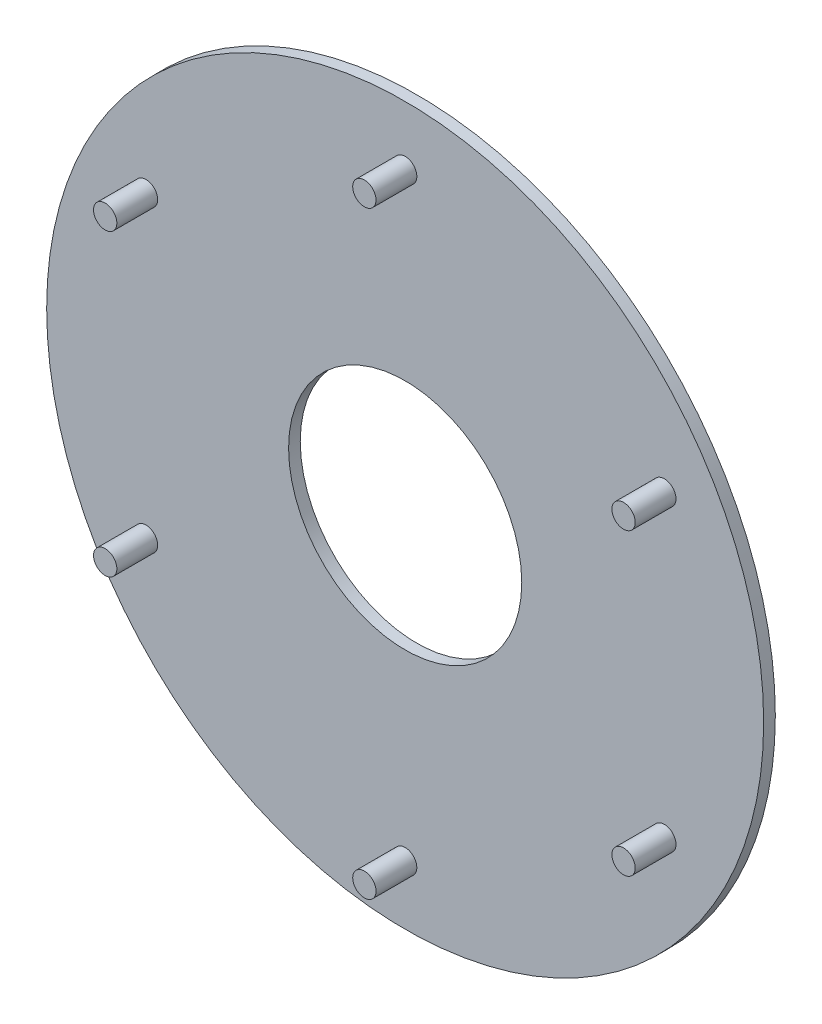
ISO-10303-21;
HEADER;
FILE_DESCRIPTION(('STEP AP214'),'2;1');
FILE_NAME('part.step','',(''),(''),'','','');
FILE_SCHEMA(('AUTOMOTIVE_DESIGN { 1 0 10303 214 1 1 1 1 }'));
ENDSEC;
DATA;
#1=APPLICATION_CONTEXT('core data for automotive mechanical design processes');
#2=APPLICATION_PROTOCOL_DEFINITION('international standard','automotive_design',2000,#1);
#3=PRODUCT_CONTEXT('',#1,'mechanical');
#4=PRODUCT('Part','Part','',(#3));
#5=PRODUCT_RELATED_PRODUCT_CATEGORY('part','',(#4));
#6=PRODUCT_DEFINITION_FORMATION('','',#4);
#7=PRODUCT_DEFINITION_CONTEXT('part definition',#1,'design');
#8=PRODUCT_DEFINITION('design','',#6,#7);
#9=PRODUCT_DEFINITION_SHAPE('','',#8);
#10=(LENGTH_UNIT() NAMED_UNIT(*) SI_UNIT(.MILLI.,.METRE.));
#11=(NAMED_UNIT(*) PLANE_ANGLE_UNIT() SI_UNIT($,.RADIAN.));
#12=(NAMED_UNIT(*) SI_UNIT($,.STERADIAN.) SOLID_ANGLE_UNIT());
#13=UNCERTAINTY_MEASURE_WITH_UNIT(LENGTH_MEASURE(1.E-05),#10,'distance_accuracy_value','');
#14=(GEOMETRIC_REPRESENTATION_CONTEXT(3) GLOBAL_UNCERTAINTY_ASSIGNED_CONTEXT((#13)) GLOBAL_UNIT_ASSIGNED_CONTEXT((#10,
#11,#12)) REPRESENTATION_CONTEXT('',''));
#15=CARTESIAN_POINT('',(0.,0.,0.));
#16=DIRECTION('',(0.,0.,1.));
#17=DIRECTION('',(1.,0.,0.));
#18=AXIS2_PLACEMENT_3D('',#15,#16,#17);
#19=CARTESIAN_POINT('',(0.,0.,-2.));
#20=DIRECTION('',(0.,0.,1.));
#21=DIRECTION('',(1.,0.,0.));
#22=AXIS2_PLACEMENT_3D('',#19,#20,#21);
#23=CYLINDRICAL_SURFACE('',#22,61.5);
#24=CARTESIAN_POINT('',(0.,0.,-2.));
#25=DIRECTION('',(0.,0.,1.));
#26=DIRECTION('',(1.,0.,0.));
#27=AXIS2_PLACEMENT_3D('',#24,#25,#26);
#28=CIRCLE('',#27,61.5);
#29=CARTESIAN_POINT('',(61.5,0.,-2.));
#30=VERTEX_POINT('',#29);
#31=EDGE_CURVE('E10',#30,#30,#28,.T.);
#32=ORIENTED_EDGE('',*,*,#31,.T.);
#33=EDGE_LOOP('',(#32));
#34=FACE_BOUND('',#33,.T.);
#35=CARTESIAN_POINT('',(0.,0.,0.));
#36=DIRECTION('',(0.,0.,1.));
#37=DIRECTION('',(1.,0.,0.));
#38=AXIS2_PLACEMENT_3D('',#35,#36,#37);
#39=CIRCLE('',#38,61.5);
#40=CARTESIAN_POINT('',(61.5,0.,0.));
#41=VERTEX_POINT('',#40);
#42=EDGE_CURVE('E37',#41,#41,#39,.T.);
#43=ORIENTED_EDGE('',*,*,#42,.F.);
#44=EDGE_LOOP('',(#43));
#45=FACE_BOUND('',#44,.T.);
#46=ADVANCED_FACE('F34',(#34,#45),#23,.T.);
#47=CARTESIAN_POINT('',(0.,0.,-2.));
#48=DIRECTION('',(0.,0.,1.));
#49=DIRECTION('',(1.,0.,0.));
#50=AXIS2_PLACEMENT_3D('',#47,#48,#49);
#51=PLANE('',#50);
#52=CARTESIAN_POINT('',(0.,0.,-2.));
#53=DIRECTION('',(0.,0.,1.));
#54=DIRECTION('',(1.,0.,0.));
#55=AXIS2_PLACEMENT_3D('',#52,#53,#54);
#56=CIRCLE('',#55,20.);
#57=CARTESIAN_POINT('',(20.,0.,-2.));
#58=VERTEX_POINT('',#57);
#59=EDGE_CURVE('E79',#58,#58,#56,.T.);
#60=ORIENTED_EDGE('',*,*,#59,.T.);
#61=EDGE_LOOP('',(#60));
#62=FACE_BOUND('',#61,.T.);
#63=ORIENTED_EDGE('',*,*,#31,.F.);
#64=EDGE_LOOP('',(#63));
#65=FACE_BOUND('',#64,.T.);
#66=ADVANCED_FACE('F88',(#62,#65),#51,.F.);
#67=CARTESIAN_POINT('',(0.,0.,0.));
#68=DIRECTION('',(0.,0.,1.));
#69=DIRECTION('',(1.,0.,0.));
#70=AXIS2_PLACEMENT_3D('',#67,#68,#69);
#71=PLANE('',#70);
#72=CARTESIAN_POINT('',(0.,0.,0.));
#73=DIRECTION('',(0.,0.,1.));
#74=DIRECTION('',(1.,0.,0.));
#75=AXIS2_PLACEMENT_3D('',#72,#73,#74);
#76=CIRCLE('',#75,20.);
#77=CARTESIAN_POINT('',(20.,0.,0.));
#78=VERTEX_POINT('',#77);
#79=EDGE_CURVE('E82',#78,#78,#76,.T.);
#80=ORIENTED_EDGE('',*,*,#79,.F.);
#81=EDGE_LOOP('',(#80));
#82=FACE_BOUND('',#81,.T.);
#83=CARTESIAN_POINT('',(-44.4602821323715,25.6691558573721,0.));
#84=DIRECTION('',(0.,0.,1.));
#85=DIRECTION('',(0.50000000000001,0.866025403784433,0.));
#86=AXIS2_PLACEMENT_3D('',#83,#84,#85);
#87=CIRCLE('',#86,2.);
#88=CARTESIAN_POINT('',(-43.4602821323715,27.401206664941,0.));
#89=VERTEX_POINT('',#88);
#90=EDGE_CURVE('E76',#89,#89,#87,.T.);
#91=ORIENTED_EDGE('',*,*,#90,.F.);
#92=EDGE_LOOP('',(#91));
#93=FACE_BOUND('',#92,.T.);
#94=CARTESIAN_POINT('',(-44.4602821323721,-25.6691558573712,0.));
#95=DIRECTION('',(0.,0.,1.));
#96=DIRECTION('',(-0.499999999999992,0.866025403784443,0.));
#97=AXIS2_PLACEMENT_3D('',#94,#95,#96);
#98=CIRCLE('',#97,2.);
#99=CARTESIAN_POINT('',(-45.4602821323721,-23.9371050498023,0.));
#100=VERTEX_POINT('',#99);
#101=EDGE_CURVE('E70',#100,#100,#98,.T.);
#102=ORIENTED_EDGE('',*,*,#101,.F.);
#103=EDGE_LOOP('',(#102));
#104=FACE_BOUND('',#103,.T.);
#105=CARTESIAN_POINT('',(0.,-51.3383117147432,0.));
#106=DIRECTION('',(0.,0.,1.));
#107=DIRECTION('',(-1.,0.,0.));
#108=AXIS2_PLACEMENT_3D('',#105,#106,#107);
#109=CIRCLE('',#108,2.);
#110=CARTESIAN_POINT('',(-2.,-51.3383117147432,0.));
#111=VERTEX_POINT('',#110);
#112=EDGE_CURVE('E64',#111,#111,#109,.T.);
#113=ORIENTED_EDGE('',*,*,#112,.F.);
#114=EDGE_LOOP('',(#113));
#115=FACE_BOUND('',#114,.T.);
#116=CARTESIAN_POINT('',(44.4602821323717,-25.6691558573718,0.));
#117=DIRECTION('',(0.,0.,1.));
#118=DIRECTION('',(-0.500000000000004,-0.866025403784436,0.));
#119=AXIS2_PLACEMENT_3D('',#116,#117,#118);
#120=CIRCLE('',#119,2.);
#121=CARTESIAN_POINT('',(43.4602821323717,-27.4012066649407,0.));
#122=VERTEX_POINT('',#121);
#123=EDGE_CURVE('E58',#122,#122,#120,.T.);
#124=ORIENTED_EDGE('',*,*,#123,.F.);
#125=EDGE_LOOP('',(#124));
#126=FACE_BOUND('',#125,.T.);
#127=CARTESIAN_POINT('',(44.4602821323719,25.6691558573715,0.));
#128=DIRECTION('',(0.,0.,1.));
#129=DIRECTION('',(0.499999999999998,-0.86602540378444,0.));
#130=AXIS2_PLACEMENT_3D('',#127,#128,#129);
#131=CIRCLE('',#130,2.);
#132=CARTESIAN_POINT('',(45.4602821323719,23.9371050498026,0.));
#133=VERTEX_POINT('',#132);
#134=EDGE_CURVE('E52',#133,#133,#131,.T.);
#135=ORIENTED_EDGE('',*,*,#134,.F.);
#136=EDGE_LOOP('',(#135));
#137=FACE_BOUND('',#136,.T.);
#138=CARTESIAN_POINT('',(0.,51.3383117147432,0.));
#139=DIRECTION('',(0.,0.,1.));
#140=DIRECTION('',(1.,0.,0.));
#141=AXIS2_PLACEMENT_3D('',#138,#139,#140);
#142=CIRCLE('',#141,2.);
#143=CARTESIAN_POINT('',(2.,51.3383117147432,0.));
#144=VERTEX_POINT('',#143);
#145=EDGE_CURVE('E46',#144,#144,#142,.T.);
#146=ORIENTED_EDGE('',*,*,#145,.F.);
#147=EDGE_LOOP('',(#146));
#148=FACE_BOUND('',#147,.T.);
#149=ORIENTED_EDGE('',*,*,#42,.T.);
#150=EDGE_LOOP('',(#149));
#151=FACE_BOUND('',#150,.T.);
#152=ADVANCED_FACE('F98',(#82,#93,#104,#115,#126,#137,#148,#151),#71,.T.);
#153=CARTESIAN_POINT('',(0.,51.3383117147432,7.));
#154=DIRECTION('',(0.,0.,-1.));
#155=DIRECTION('',(-1.,0.,0.));
#156=AXIS2_PLACEMENT_3D('',#153,#154,#155);
#157=CYLINDRICAL_SURFACE('',#156,2.);
#158=CARTESIAN_POINT('',(0.,51.3383117147432,7.));
#159=DIRECTION('',(0.,0.,1.));
#160=DIRECTION('',(1.,0.,0.));
#161=AXIS2_PLACEMENT_3D('',#158,#159,#160);
#162=CIRCLE('',#161,2.);
#163=CARTESIAN_POINT('',(2.,51.3383117147432,7.));
#164=VERTEX_POINT('',#163);
#165=EDGE_CURVE('E44',#164,#164,#162,.T.);
#166=ORIENTED_EDGE('',*,*,#165,.F.);
#167=EDGE_LOOP('',(#166));
#168=FACE_BOUND('',#167,.T.);
#169=ORIENTED_EDGE('',*,*,#145,.T.);
#170=EDGE_LOOP('',(#169));
#171=FACE_BOUND('',#170,.T.);
#172=ADVANCED_FACE('F101',(#168,#171),#157,.T.);
#173=CARTESIAN_POINT('',(0.,51.3383117147432,7.));
#174=DIRECTION('',(0.,0.,1.));
#175=DIRECTION('',(1.,0.,0.));
#176=AXIS2_PLACEMENT_3D('',#173,#174,#175);
#177=PLANE('',#176);
#178=ORIENTED_EDGE('',*,*,#165,.T.);
#179=EDGE_LOOP('',(#178));
#180=FACE_BOUND('',#179,.T.);
#181=ADVANCED_FACE('F126',(#180),#177,.T.);
#182=CARTESIAN_POINT('',(44.4602821323719,25.6691558573715,7.));
#183=DIRECTION('',(0.,0.,-1.));
#184=DIRECTION('',(-1.,0.,0.));
#185=AXIS2_PLACEMENT_3D('',#182,#183,#184);
#186=CYLINDRICAL_SURFACE('',#185,2.);
#187=CARTESIAN_POINT('',(44.4602821323719,25.6691558573715,7.));
#188=DIRECTION('',(0.,0.,1.));
#189=DIRECTION('',(0.499999999999998,-0.86602540378444,0.));
#190=AXIS2_PLACEMENT_3D('',#187,#188,#189);
#191=CIRCLE('',#190,2.);
#192=CARTESIAN_POINT('',(45.4602821323719,23.9371050498026,7.));
#193=VERTEX_POINT('',#192);
#194=EDGE_CURVE('E49',#193,#193,#191,.T.);
#195=ORIENTED_EDGE('',*,*,#194,.F.);
#196=EDGE_LOOP('',(#195));
#197=FACE_BOUND('',#196,.T.);
#198=ORIENTED_EDGE('',*,*,#134,.T.);
#199=EDGE_LOOP('',(#198));
#200=FACE_BOUND('',#199,.T.);
#201=ADVANCED_FACE('F130',(#197,#200),#186,.T.);
#202=CARTESIAN_POINT('',(44.4602821323719,25.6691558573715,7.));
#203=DIRECTION('',(0.,0.,1.));
#204=DIRECTION('',(0.499999999999998,-0.86602540378444,0.));
#205=AXIS2_PLACEMENT_3D('',#202,#203,#204);
#206=PLANE('',#205);
#207=ORIENTED_EDGE('',*,*,#194,.T.);
#208=EDGE_LOOP('',(#207));
#209=FACE_BOUND('',#208,.T.);
#210=ADVANCED_FACE('F134',(#209),#206,.T.);
#211=CARTESIAN_POINT('',(44.4602821323717,-25.6691558573718,7.));
#212=DIRECTION('',(0.,0.,-1.));
#213=DIRECTION('',(-1.,0.,0.));
#214=AXIS2_PLACEMENT_3D('',#211,#212,#213);
#215=CYLINDRICAL_SURFACE('',#214,2.);
#216=CARTESIAN_POINT('',(44.4602821323717,-25.6691558573718,7.));
#217=DIRECTION('',(0.,0.,1.));
#218=DIRECTION('',(-0.500000000000004,-0.866025403784436,0.));
#219=AXIS2_PLACEMENT_3D('',#216,#217,#218);
#220=CIRCLE('',#219,2.);
#221=CARTESIAN_POINT('',(43.4602821323717,-27.4012066649407,7.));
#222=VERTEX_POINT('',#221);
#223=EDGE_CURVE('E55',#222,#222,#220,.T.);
#224=ORIENTED_EDGE('',*,*,#223,.F.);
#225=EDGE_LOOP('',(#224));
#226=FACE_BOUND('',#225,.T.);
#227=ORIENTED_EDGE('',*,*,#123,.T.);
#228=EDGE_LOOP('',(#227));
#229=FACE_BOUND('',#228,.T.);
#230=ADVANCED_FACE('F138',(#226,#229),#215,.T.);
#231=CARTESIAN_POINT('',(44.4602821323717,-25.6691558573718,7.));
#232=DIRECTION('',(0.,0.,1.));
#233=DIRECTION('',(-0.500000000000004,-0.866025403784436,0.));
#234=AXIS2_PLACEMENT_3D('',#231,#232,#233);
#235=PLANE('',#234);
#236=ORIENTED_EDGE('',*,*,#223,.T.);
#237=EDGE_LOOP('',(#236));
#238=FACE_BOUND('',#237,.T.);
#239=ADVANCED_FACE('F142',(#238),#235,.T.);
#240=CARTESIAN_POINT('',(0.,-51.3383117147432,7.));
#241=DIRECTION('',(0.,0.,-1.));
#242=DIRECTION('',(-1.,0.,0.));
#243=AXIS2_PLACEMENT_3D('',#240,#241,#242);
#244=CYLINDRICAL_SURFACE('',#243,2.);
#245=CARTESIAN_POINT('',(0.,-51.3383117147432,7.));
#246=DIRECTION('',(0.,0.,1.));
#247=DIRECTION('',(-1.,0.,0.));
#248=AXIS2_PLACEMENT_3D('',#245,#246,#247);
#249=CIRCLE('',#248,2.);
#250=CARTESIAN_POINT('',(-2.,-51.3383117147432,7.));
#251=VERTEX_POINT('',#250);
#252=EDGE_CURVE('E61',#251,#251,#249,.T.);
#253=ORIENTED_EDGE('',*,*,#252,.F.);
#254=EDGE_LOOP('',(#253));
#255=FACE_BOUND('',#254,.T.);
#256=ORIENTED_EDGE('',*,*,#112,.T.);
#257=EDGE_LOOP('',(#256));
#258=FACE_BOUND('',#257,.T.);
#259=ADVANCED_FACE('F146',(#255,#258),#244,.T.);
#260=CARTESIAN_POINT('',(0.,-51.3383117147432,7.));
#261=DIRECTION('',(0.,0.,1.));
#262=DIRECTION('',(-1.,0.,0.));
#263=AXIS2_PLACEMENT_3D('',#260,#261,#262);
#264=PLANE('',#263);
#265=ORIENTED_EDGE('',*,*,#252,.T.);
#266=EDGE_LOOP('',(#265));
#267=FACE_BOUND('',#266,.T.);
#268=ADVANCED_FACE('F150',(#267),#264,.T.);
#269=CARTESIAN_POINT('',(-44.4602821323721,-25.6691558573712,7.));
#270=DIRECTION('',(0.,0.,-1.));
#271=DIRECTION('',(-1.,0.,0.));
#272=AXIS2_PLACEMENT_3D('',#269,#270,#271);
#273=CYLINDRICAL_SURFACE('',#272,2.);
#274=CARTESIAN_POINT('',(-44.4602821323721,-25.6691558573712,7.));
#275=DIRECTION('',(0.,0.,1.));
#276=DIRECTION('',(-0.499999999999992,0.866025403784443,0.));
#277=AXIS2_PLACEMENT_3D('',#274,#275,#276);
#278=CIRCLE('',#277,2.);
#279=CARTESIAN_POINT('',(-45.4602821323721,-23.9371050498023,7.));
#280=VERTEX_POINT('',#279);
#281=EDGE_CURVE('E67',#280,#280,#278,.T.);
#282=ORIENTED_EDGE('',*,*,#281,.F.);
#283=EDGE_LOOP('',(#282));
#284=FACE_BOUND('',#283,.T.);
#285=ORIENTED_EDGE('',*,*,#101,.T.);
#286=EDGE_LOOP('',(#285));
#287=FACE_BOUND('',#286,.T.);
#288=ADVANCED_FACE('F154',(#284,#287),#273,.T.);
#289=CARTESIAN_POINT('',(-44.4602821323721,-25.6691558573712,7.));
#290=DIRECTION('',(0.,0.,1.));
#291=DIRECTION('',(-0.499999999999992,0.866025403784443,0.));
#292=AXIS2_PLACEMENT_3D('',#289,#290,#291);
#293=PLANE('',#292);
#294=ORIENTED_EDGE('',*,*,#281,.T.);
#295=EDGE_LOOP('',(#294));
#296=FACE_BOUND('',#295,.T.);
#297=ADVANCED_FACE('F158',(#296),#293,.T.);
#298=CARTESIAN_POINT('',(-44.4602821323715,25.6691558573721,7.));
#299=DIRECTION('',(0.,0.,-1.));
#300=DIRECTION('',(-1.,0.,0.));
#301=AXIS2_PLACEMENT_3D('',#298,#299,#300);
#302=CYLINDRICAL_SURFACE('',#301,2.);
#303=CARTESIAN_POINT('',(-44.4602821323715,25.6691558573721,7.));
#304=DIRECTION('',(0.,0.,1.));
#305=DIRECTION('',(0.50000000000001,0.866025403784433,0.));
#306=AXIS2_PLACEMENT_3D('',#303,#304,#305);
#307=CIRCLE('',#306,2.);
#308=CARTESIAN_POINT('',(-43.4602821323715,27.401206664941,7.));
#309=VERTEX_POINT('',#308);
#310=EDGE_CURVE('E73',#309,#309,#307,.T.);
#311=ORIENTED_EDGE('',*,*,#310,.F.);
#312=EDGE_LOOP('',(#311));
#313=FACE_BOUND('',#312,.T.);
#314=ORIENTED_EDGE('',*,*,#90,.T.);
#315=EDGE_LOOP('',(#314));
#316=FACE_BOUND('',#315,.T.);
#317=ADVANCED_FACE('F162',(#313,#316),#302,.T.);
#318=CARTESIAN_POINT('',(-44.4602821323715,25.6691558573721,7.));
#319=DIRECTION('',(0.,0.,1.));
#320=DIRECTION('',(0.50000000000001,0.866025403784433,0.));
#321=AXIS2_PLACEMENT_3D('',#318,#319,#320);
#322=PLANE('',#321);
#323=ORIENTED_EDGE('',*,*,#310,.T.);
#324=EDGE_LOOP('',(#323));
#325=FACE_BOUND('',#324,.T.);
#326=ADVANCED_FACE('F94',(#325),#322,.T.);
#327=CARTESIAN_POINT('',(0.,0.,-2.));
#328=DIRECTION('',(0.,0.,1.));
#329=DIRECTION('',(1.,0.,0.));
#330=AXIS2_PLACEMENT_3D('',#327,#328,#329);
#331=CYLINDRICAL_SURFACE('',#330,20.);
#332=ORIENTED_EDGE('',*,*,#59,.F.);
#333=EDGE_LOOP('',(#332));
#334=FACE_BOUND('',#333,.T.);
#335=ORIENTED_EDGE('',*,*,#79,.T.);
#336=EDGE_LOOP('',(#335));
#337=FACE_BOUND('',#336,.T.);
#338=ADVANCED_FACE('F91',(#334,#337),#331,.F.);
#339=CLOSED_SHELL('',(#46,#66,#152,#172,#181,#201,#210,#230,#239,#259,#268,#288,#297,#317,#326,#338));
#340=MANIFOLD_SOLID_BREP('B2',#339);
#341=ADVANCED_BREP_SHAPE_REPRESENTATION('',(#18,#340),#14);
#342=SHAPE_DEFINITION_REPRESENTATION(#9,#341);
ENDSEC;
END-ISO-10303-21;
